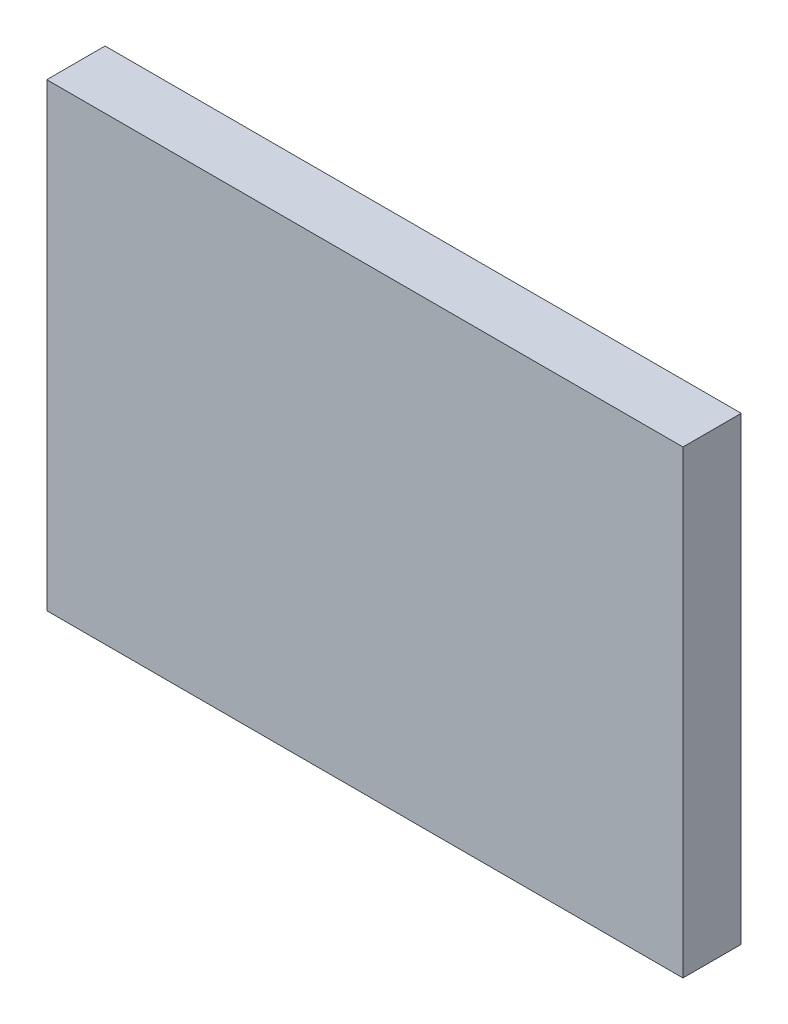
ISO-10303-21;
HEADER;
FILE_DESCRIPTION(('STEP AP214'),'2;1');
FILE_NAME('part.step','',(''),(''),'','','');
FILE_SCHEMA(('AUTOMOTIVE_DESIGN { 1 0 10303 214 1 1 1 1 }'));
ENDSEC;
DATA;
#1=APPLICATION_CONTEXT('core data for automotive mechanical design processes');
#2=APPLICATION_PROTOCOL_DEFINITION('international standard','automotive_design',2000,#1);
#3=PRODUCT_CONTEXT('',#1,'mechanical');
#4=PRODUCT('Part','Part','',(#3));
#5=PRODUCT_RELATED_PRODUCT_CATEGORY('part','',(#4));
#6=PRODUCT_DEFINITION_FORMATION('','',#4);
#7=PRODUCT_DEFINITION_CONTEXT('part definition',#1,'design');
#8=PRODUCT_DEFINITION('design','',#6,#7);
#9=PRODUCT_DEFINITION_SHAPE('','',#8);
#10=(LENGTH_UNIT() NAMED_UNIT(*) SI_UNIT(.MILLI.,.METRE.));
#11=(NAMED_UNIT(*) PLANE_ANGLE_UNIT() SI_UNIT($,.RADIAN.));
#12=(NAMED_UNIT(*) SI_UNIT($,.STERADIAN.) SOLID_ANGLE_UNIT());
#13=UNCERTAINTY_MEASURE_WITH_UNIT(LENGTH_MEASURE(1.E-05),#10,'distance_accuracy_value','');
#14=(GEOMETRIC_REPRESENTATION_CONTEXT(3) GLOBAL_UNCERTAINTY_ASSIGNED_CONTEXT((#13)) GLOBAL_UNIT_ASSIGNED_CONTEXT((#10,
#11,#12)) REPRESENTATION_CONTEXT('',''));
#15=CARTESIAN_POINT('',(0.,0.,0.));
#16=DIRECTION('',(0.,0.,1.));
#17=DIRECTION('',(1.,0.,0.));
#18=AXIS2_PLACEMENT_3D('',#15,#16,#17);
#19=CARTESIAN_POINT('',(6.912,3.888,1.));
#20=DIRECTION('',(0.,-1.,0.));
#21=DIRECTION('',(1.,0.,0.));
#22=AXIS2_PLACEMENT_3D('',#19,#20,#21);
#23=PLANE('',#22);
#24=DIRECTION('',(-1.,0.,0.));
#25=VECTOR('',#24,1.);
#26=CARTESIAN_POINT('',(6.912,3.888,0.));
#27=LINE('',#26,#25);
#28=CARTESIAN_POINT('',(6.912,3.888,0.));
#29=VERTEX_POINT('',#28);
#30=CARTESIAN_POINT('',(0.,3.888,0.));
#31=VERTEX_POINT('',#30);
#32=EDGE_CURVE('E202',#29,#31,#27,.T.);
#33=ORIENTED_EDGE('',*,*,#32,.T.);
#34=DIRECTION('',(0.,0.,-1.));
#35=VECTOR('',#34,1.);
#36=CARTESIAN_POINT('',(0.,3.888,1.));
#37=LINE('',#36,#35);
#38=CARTESIAN_POINT('',(0.,3.888,1.));
#39=VERTEX_POINT('',#38);
#40=EDGE_CURVE('E11',#39,#31,#37,.T.);
#41=ORIENTED_EDGE('',*,*,#40,.F.);
#42=DIRECTION('',(-1.,0.,0.));
#43=VECTOR('',#42,1.);
#44=CARTESIAN_POINT('',(6.912,3.888,1.));
#45=LINE('',#44,#43);
#46=CARTESIAN_POINT('',(6.912,3.888,1.));
#47=VERTEX_POINT('',#46);
#48=EDGE_CURVE('E203',#47,#39,#45,.T.);
#49=ORIENTED_EDGE('',*,*,#48,.F.);
#50=DIRECTION('',(0.,0.,-1.));
#51=VECTOR('',#50,1.);
#52=CARTESIAN_POINT('',(6.912,3.888,1.));
#53=LINE('',#52,#51);
#54=EDGE_CURVE('E213',#47,#29,#53,.T.);
#55=ORIENTED_EDGE('',*,*,#54,.T.);
#56=EDGE_LOOP('',(#33,#41,#49,#55));
#57=FACE_BOUND('',#56,.T.);
#58=ADVANCED_FACE('F36',(#57),#23,.F.);
#59=CARTESIAN_POINT('',(0.,0.,1.));
#60=DIRECTION('',(-1.,0.,0.));
#61=DIRECTION('',(0.,-1.,0.));
#62=AXIS2_PLACEMENT_3D('',#59,#60,#61);
#63=PLANE('',#62);
#64=DIRECTION('',(0.,1.,0.));
#65=VECTOR('',#64,1.);
#66=CARTESIAN_POINT('',(0.,0.,0.));
#67=LINE('',#66,#65);
#68=CARTESIAN_POINT('',(0.,0.,0.));
#69=VERTEX_POINT('',#68);
#70=EDGE_CURVE('E215',#69,#31,#67,.T.);
#71=ORIENTED_EDGE('',*,*,#70,.F.);
#72=DIRECTION('',(0.,0.,-1.));
#73=VECTOR('',#72,1.);
#74=CARTESIAN_POINT('',(0.,0.,1.));
#75=LINE('',#74,#73);
#76=CARTESIAN_POINT('',(0.,0.,1.));
#77=VERTEX_POINT('',#76);
#78=EDGE_CURVE('E43',#77,#69,#75,.T.);
#79=ORIENTED_EDGE('',*,*,#78,.F.);
#80=DIRECTION('',(0.,1.,0.));
#81=VECTOR('',#80,1.);
#82=CARTESIAN_POINT('',(0.,0.,1.));
#83=LINE('',#82,#81);
#84=EDGE_CURVE('E206',#77,#39,#83,.T.);
#85=ORIENTED_EDGE('',*,*,#84,.T.);
#86=ORIENTED_EDGE('',*,*,#40,.T.);
#87=EDGE_LOOP('',(#71,#79,#85,#86));
#88=FACE_BOUND('',#87,.T.);
#89=ADVANCED_FACE('F228',(#88),#63,.T.);
#90=CARTESIAN_POINT('',(6.912,0.,1.));
#91=DIRECTION('',(0.,-1.,0.));
#92=DIRECTION('',(0.,0.,-1.));
#93=AXIS2_PLACEMENT_3D('',#90,#91,#92);
#94=PLANE('',#93);
#95=DIRECTION('',(-1.,0.,0.));
#96=VECTOR('',#95,1.);
#97=CARTESIAN_POINT('',(6.912,0.,0.));
#98=LINE('',#97,#96);
#99=CARTESIAN_POINT('',(6.912,0.,0.));
#100=VERTEX_POINT('',#99);
#101=EDGE_CURVE('E218',#100,#69,#98,.T.);
#102=ORIENTED_EDGE('',*,*,#101,.F.);
#103=DIRECTION('',(0.,0.,-1.));
#104=VECTOR('',#103,1.);
#105=CARTESIAN_POINT('',(6.912,0.,1.));
#106=LINE('',#105,#104);
#107=CARTESIAN_POINT('',(6.912,0.,1.));
#108=VERTEX_POINT('',#107);
#109=EDGE_CURVE('E59',#108,#100,#106,.T.);
#110=ORIENTED_EDGE('',*,*,#109,.F.);
#111=DIRECTION('',(-1.,0.,0.));
#112=VECTOR('',#111,1.);
#113=CARTESIAN_POINT('',(6.912,0.,1.));
#114=LINE('',#113,#112);
#115=EDGE_CURVE('E208',#108,#77,#114,.T.);
#116=ORIENTED_EDGE('',*,*,#115,.T.);
#117=ORIENTED_EDGE('',*,*,#78,.T.);
#118=EDGE_LOOP('',(#102,#110,#116,#117));
#119=FACE_BOUND('',#118,.T.);
#120=ADVANCED_FACE('F224',(#119),#94,.T.);
#121=CARTESIAN_POINT('',(6.912,0.,1.));
#122=DIRECTION('',(-1.,0.,0.));
#123=DIRECTION('',(0.,0.,1.));
#124=AXIS2_PLACEMENT_3D('',#121,#122,#123);
#125=PLANE('',#124);
#126=DIRECTION('',(0.,1.,0.));
#127=VECTOR('',#126,1.);
#128=CARTESIAN_POINT('',(6.912,0.,0.));
#129=LINE('',#128,#127);
#130=EDGE_CURVE('E78',#100,#29,#129,.T.);
#131=ORIENTED_EDGE('',*,*,#130,.T.);
#132=ORIENTED_EDGE('',*,*,#54,.F.);
#133=DIRECTION('',(0.,1.,0.));
#134=VECTOR('',#133,1.);
#135=CARTESIAN_POINT('',(6.912,0.,1.));
#136=LINE('',#135,#134);
#137=EDGE_CURVE('E210',#108,#47,#136,.T.);
#138=ORIENTED_EDGE('',*,*,#137,.F.);
#139=ORIENTED_EDGE('',*,*,#109,.T.);
#140=EDGE_LOOP('',(#131,#132,#138,#139));
#141=FACE_BOUND('',#140,.T.);
#142=ADVANCED_FACE('F232',(#141),#125,.F.);
#143=CARTESIAN_POINT('',(0.,0.,0.));
#144=DIRECTION('',(0.,0.,-1.));
#145=DIRECTION('',(-1.,0.,0.));
#146=AXIS2_PLACEMENT_3D('',#143,#144,#145);
#147=PLANE('',#146);
#148=DIRECTION('',(-0.707106781186548,-0.707106781186547,0.));
#149=VECTOR('',#148,1.);
#150=CARTESIAN_POINT('',(3.456,2.444,0.));
#151=LINE('',#150,#149);
#152=CARTESIAN_POINT('',(3.456,2.444,0.));
#153=VERTEX_POINT('',#152);
#154=CARTESIAN_POINT('',(2.96106125524031,1.94906125524031,0.));
#155=VERTEX_POINT('',#154);
#156=EDGE_CURVE('E422',#153,#155,#151,.T.);
#157=ORIENTED_EDGE('',*,*,#156,.T.);
#158=DIRECTION('',(-0.707106781186547,0.707106781186547,0.));
#159=VECTOR('',#158,1.);
#160=CARTESIAN_POINT('',(3.46106125524031,1.44906125524031,0.));
#161=LINE('',#160,#159);
#162=CARTESIAN_POINT('',(3.46106125524031,1.44906125524031,0.));
#163=VERTEX_POINT('',#162);
#164=EDGE_CURVE('E426',#163,#155,#161,.T.);
#165=ORIENTED_EDGE('',*,*,#164,.F.);
#166=DIRECTION('',(-0.707106781186548,-0.707106781186547,0.));
#167=VECTOR('',#166,1.);
#168=CARTESIAN_POINT('',(3.956,1.944,0.));
#169=LINE('',#168,#167);
#170=CARTESIAN_POINT('',(3.956,1.944,0.));
#171=VERTEX_POINT('',#170);
#172=EDGE_CURVE('E428',#171,#163,#169,.T.);
#173=ORIENTED_EDGE('',*,*,#172,.F.);
#174=DIRECTION('',(-0.707106781186547,0.707106781186547,0.));
#175=VECTOR('',#174,1.);
#176=CARTESIAN_POINT('',(3.956,1.944,0.));
#177=LINE('',#176,#175);
#178=EDGE_CURVE('E163',#171,#153,#177,.T.);
#179=ORIENTED_EDGE('',*,*,#178,.T.);
#180=EDGE_LOOP('',(#157,#165,#173,#179));
#181=FACE_BOUND('',#180,.T.);
#182=ORIENTED_EDGE('',*,*,#32,.F.);
#183=ORIENTED_EDGE('',*,*,#130,.F.);
#184=ORIENTED_EDGE('',*,*,#101,.T.);
#185=ORIENTED_EDGE('',*,*,#70,.T.);
#186=EDGE_LOOP('',(#182,#183,#184,#185));
#187=FACE_BOUND('',#186,.T.);
#188=ADVANCED_FACE('F231',(#181,#187),#147,.T.);
#189=CARTESIAN_POINT('',(-2.,-2.,2.));
#190=DIRECTION('',(0.,1.,0.));
#191=DIRECTION('',(0.,0.,1.));
#192=AXIS2_PLACEMENT_3D('',#189,#190,#191);
#193=PLANE('',#192);
#194=DIRECTION('',(1.,0.,0.));
#195=VECTOR('',#194,1.);
#196=CARTESIAN_POINT('',(-2.,-2.,1.));
#197=LINE('',#196,#195);
#198=CARTESIAN_POINT('',(-2.,-2.,1.));
#199=VERTEX_POINT('',#198);
#200=CARTESIAN_POINT('',(8.912,-2.,1.));
#201=VERTEX_POINT('',#200);
#202=EDGE_CURVE('E167',#199,#201,#197,.T.);
#203=ORIENTED_EDGE('',*,*,#202,.T.);
#204=DIRECTION('',(0.,0.,-1.));
#205=VECTOR('',#204,1.);
#206=CARTESIAN_POINT('',(8.912,-2.,2.));
#207=LINE('',#206,#205);
#208=CARTESIAN_POINT('',(8.912,-2.,2.));
#209=VERTEX_POINT('',#208);
#210=EDGE_CURVE('E200',#209,#201,#207,.T.);
#211=ORIENTED_EDGE('',*,*,#210,.F.);
#212=DIRECTION('',(1.,0.,0.));
#213=VECTOR('',#212,1.);
#214=CARTESIAN_POINT('',(-2.,-2.,2.));
#215=LINE('',#214,#213);
#216=CARTESIAN_POINT('',(-2.,-2.,2.));
#217=VERTEX_POINT('',#216);
#218=EDGE_CURVE('E173',#217,#209,#215,.T.);
#219=ORIENTED_EDGE('',*,*,#218,.F.);
#220=DIRECTION('',(0.,0.,-1.));
#221=VECTOR('',#220,1.);
#222=CARTESIAN_POINT('',(-2.,-2.,2.));
#223=LINE('',#222,#221);
#224=EDGE_CURVE('E184',#217,#199,#223,.T.);
#225=ORIENTED_EDGE('',*,*,#224,.T.);
#226=EDGE_LOOP('',(#203,#211,#219,#225));
#227=FACE_BOUND('',#226,.T.);
#228=ADVANCED_FACE('F246',(#227),#193,.F.);
#229=CARTESIAN_POINT('',(8.912,5.888,2.));
#230=DIRECTION('',(1.,0.,0.));
#231=DIRECTION('',(0.,0.,-1.));
#232=AXIS2_PLACEMENT_3D('',#229,#230,#231);
#233=PLANE('',#232);
#234=DIRECTION('',(0.,-1.,0.));
#235=VECTOR('',#234,1.);
#236=CARTESIAN_POINT('',(8.912,5.888,1.));
#237=LINE('',#236,#235);
#238=CARTESIAN_POINT('',(8.912,5.888,1.));
#239=VERTEX_POINT('',#238);
#240=EDGE_CURVE('E187',#239,#201,#237,.T.);
#241=ORIENTED_EDGE('',*,*,#240,.F.);
#242=DIRECTION('',(0.,0.,-1.));
#243=VECTOR('',#242,1.);
#244=CARTESIAN_POINT('',(8.912,5.888,2.));
#245=LINE('',#244,#243);
#246=CARTESIAN_POINT('',(8.912,5.888,2.));
#247=VERTEX_POINT('',#246);
#248=EDGE_CURVE('E198',#247,#239,#245,.T.);
#249=ORIENTED_EDGE('',*,*,#248,.F.);
#250=DIRECTION('',(0.,-1.,0.));
#251=VECTOR('',#250,1.);
#252=CARTESIAN_POINT('',(8.912,5.888,2.));
#253=LINE('',#252,#251);
#254=EDGE_CURVE('E175',#247,#209,#253,.T.);
#255=ORIENTED_EDGE('',*,*,#254,.T.);
#256=ORIENTED_EDGE('',*,*,#210,.T.);
#257=EDGE_LOOP('',(#241,#249,#255,#256));
#258=FACE_BOUND('',#257,.T.);
#259=ADVANCED_FACE('F257',(#258),#233,.T.);
#260=CARTESIAN_POINT('',(-2.,5.888,2.));
#261=DIRECTION('',(0.,1.,0.));
#262=DIRECTION('',(0.,0.,1.));
#263=AXIS2_PLACEMENT_3D('',#260,#261,#262);
#264=PLANE('',#263);
#265=DIRECTION('',(1.,0.,0.));
#266=VECTOR('',#265,1.);
#267=CARTESIAN_POINT('',(-2.,5.888,1.));
#268=LINE('',#267,#266);
#269=CARTESIAN_POINT('',(-2.,5.888,1.));
#270=VERTEX_POINT('',#269);
#271=EDGE_CURVE('E190',#270,#239,#268,.T.);
#272=ORIENTED_EDGE('',*,*,#271,.F.);
#273=DIRECTION('',(0.,0.,-1.));
#274=VECTOR('',#273,1.);
#275=CARTESIAN_POINT('',(-2.,5.888,2.));
#276=LINE('',#275,#274);
#277=CARTESIAN_POINT('',(-2.,5.888,2.));
#278=VERTEX_POINT('',#277);
#279=EDGE_CURVE('E196',#278,#270,#276,.T.);
#280=ORIENTED_EDGE('',*,*,#279,.F.);
#281=DIRECTION('',(1.,0.,0.));
#282=VECTOR('',#281,1.);
#283=CARTESIAN_POINT('',(-2.,5.888,2.));
#284=LINE('',#283,#282);
#285=EDGE_CURVE('E179',#278,#247,#284,.T.);
#286=ORIENTED_EDGE('',*,*,#285,.T.);
#287=ORIENTED_EDGE('',*,*,#248,.T.);
#288=EDGE_LOOP('',(#272,#280,#286,#287));
#289=FACE_BOUND('',#288,.T.);
#290=ADVANCED_FACE('F254',(#289),#264,.T.);
#291=CARTESIAN_POINT('',(-2.,5.888,2.));
#292=DIRECTION('',(1.,0.,0.));
#293=DIRECTION('',(0.,1.,0.));
#294=AXIS2_PLACEMENT_3D('',#291,#292,#293);
#295=PLANE('',#294);
#296=DIRECTION('',(0.,-1.,0.));
#297=VECTOR('',#296,1.);
#298=CARTESIAN_POINT('',(-2.,5.888,1.));
#299=LINE('',#298,#297);
#300=EDGE_CURVE('E176',#270,#199,#299,.T.);
#301=ORIENTED_EDGE('',*,*,#300,.T.);
#302=ORIENTED_EDGE('',*,*,#224,.F.);
#303=DIRECTION('',(0.,-1.,0.));
#304=VECTOR('',#303,1.);
#305=CARTESIAN_POINT('',(-2.,5.888,2.));
#306=LINE('',#305,#304);
#307=EDGE_CURVE('E182',#278,#217,#306,.T.);
#308=ORIENTED_EDGE('',*,*,#307,.F.);
#309=ORIENTED_EDGE('',*,*,#279,.T.);
#310=EDGE_LOOP('',(#301,#302,#308,#309));
#311=FACE_BOUND('',#310,.T.);
#312=ADVANCED_FACE('F251',(#311),#295,.F.);
#313=CARTESIAN_POINT('',(0.,0.,2.));
#314=DIRECTION('',(0.,0.,-1.));
#315=DIRECTION('',(-1.,0.,0.));
#316=AXIS2_PLACEMENT_3D('',#313,#314,#315);
#317=PLANE('',#316);
#318=ORIENTED_EDGE('',*,*,#218,.T.);
#319=ORIENTED_EDGE('',*,*,#254,.F.);
#320=ORIENTED_EDGE('',*,*,#285,.F.);
#321=ORIENTED_EDGE('',*,*,#307,.T.);
#322=EDGE_LOOP('',(#318,#319,#320,#321));
#323=FACE_BOUND('',#322,.T.);
#324=ADVANCED_FACE('F238',(#323),#317,.F.);
#325=CARTESIAN_POINT('',(0.,0.,1.));
#326=DIRECTION('',(0.,0.,-1.));
#327=DIRECTION('',(-1.,0.,0.));
#328=AXIS2_PLACEMENT_3D('',#325,#326,#327);
#329=PLANE('',#328);
#330=ORIENTED_EDGE('',*,*,#137,.T.);
#331=ORIENTED_EDGE('',*,*,#48,.T.);
#332=ORIENTED_EDGE('',*,*,#84,.F.);
#333=ORIENTED_EDGE('',*,*,#115,.F.);
#334=EDGE_LOOP('',(#330,#331,#332,#333));
#335=FACE_BOUND('',#334,.T.);
#336=ORIENTED_EDGE('',*,*,#202,.F.);
#337=ORIENTED_EDGE('',*,*,#300,.F.);
#338=ORIENTED_EDGE('',*,*,#271,.T.);
#339=ORIENTED_EDGE('',*,*,#240,.T.);
#340=EDGE_LOOP('',(#336,#337,#338,#339));
#341=FACE_BOUND('',#340,.T.);
#342=ADVANCED_FACE('F234',(#335,#341),#329,.T.);
#343=CARTESIAN_POINT('',(3.456,2.444,-0.48));
#344=DIRECTION('',(-0.707106781186547,0.707106781186548,0.));
#345=DIRECTION('',(-0.707106781186548,-0.707106781186547,0.));
#346=AXIS2_PLACEMENT_3D('',#343,#344,#345);
#347=PLANE('',#346);
#348=DIRECTION('',(0.583157796849037,0.583157796849036,0.565556334902506));
#349=VECTOR('',#348,1.);
#350=CARTESIAN_POINT('',(3.29769187859723,2.28569187859723,-0.153529904615212));
#351=LINE('',#350,#349);
#352=CARTESIAN_POINT('',(2.96106125524031,1.94906125524031,-0.48));
#353=VERTEX_POINT('',#352);
#354=CARTESIAN_POINT('',(3.20853062762016,2.19653062762015,-0.24));
#355=VERTEX_POINT('',#354);
#356=EDGE_CURVE('E420',#353,#355,#351,.T.);
#357=ORIENTED_EDGE('',*,*,#356,.F.);
#358=DIRECTION('',(0.,0.,1.));
#359=VECTOR('',#358,1.);
#360=CARTESIAN_POINT('',(2.96106125524031,1.94906125524031,-0.48));
#361=LINE('',#360,#359);
#362=EDGE_CURVE('E151',#353,#155,#361,.T.);
#363=ORIENTED_EDGE('',*,*,#362,.T.);
#364=ORIENTED_EDGE('',*,*,#156,.F.);
#365=DIRECTION('',(0.,0.,1.));
#366=VECTOR('',#365,1.);
#367=CARTESIAN_POINT('',(3.456,2.444,-0.48));
#368=LINE('',#367,#366);
#369=CARTESIAN_POINT('',(3.456,2.444,-0.48));
#370=VERTEX_POINT('',#369);
#371=EDGE_CURVE('E165',#370,#153,#368,.T.);
#372=ORIENTED_EDGE('',*,*,#371,.F.);
#373=DIRECTION('',(0.583157796849037,0.583157796849036,-0.565556334902506));
#374=VECTOR('',#373,1.);
#375=CARTESIAN_POINT('',(3.456,2.444,-0.479999999999999));
#376=LINE('',#375,#374);
#377=EDGE_CURVE('E147',#355,#370,#376,.T.);
#378=ORIENTED_EDGE('',*,*,#377,.F.);
#379=EDGE_LOOP('',(#357,#363,#364,#372,#378));
#380=FACE_BOUND('',#379,.T.);
#381=ADVANCED_FACE('F237',(#380),#347,.T.);
#382=CARTESIAN_POINT('',(3.956,1.944,-0.48));
#383=DIRECTION('',(0.707106781186548,0.707106781186548,0.));
#384=DIRECTION('',(-0.707106781186548,0.707106781186548,0.));
#385=AXIS2_PLACEMENT_3D('',#382,#383,#384);
#386=PLANE('',#385);
#387=ORIENTED_EDGE('',*,*,#178,.F.);
#388=DIRECTION('',(0.,0.,1.));
#389=VECTOR('',#388,1.);
#390=CARTESIAN_POINT('',(3.956,1.944,-0.48));
#391=LINE('',#390,#389);
#392=CARTESIAN_POINT('',(3.956,1.944,-0.48));
#393=VERTEX_POINT('',#392);
#394=EDGE_CURVE('E156',#393,#171,#391,.T.);
#395=ORIENTED_EDGE('',*,*,#394,.F.);
#396=DIRECTION('',(-0.707106781186547,0.707106781186547,0.));
#397=VECTOR('',#396,1.);
#398=CARTESIAN_POINT('',(3.956,1.944,-0.48));
#399=LINE('',#398,#397);
#400=EDGE_CURVE('E140',#393,#370,#399,.T.);
#401=ORIENTED_EDGE('',*,*,#400,.T.);
#402=ORIENTED_EDGE('',*,*,#371,.T.);
#403=EDGE_LOOP('',(#387,#395,#401,#402));
#404=FACE_BOUND('',#403,.T.);
#405=ADVANCED_FACE('F161',(#404),#386,.T.);
#406=CARTESIAN_POINT('',(3.956,1.944,-0.48));
#407=DIRECTION('',(-0.707106781186547,0.707106781186548,0.));
#408=DIRECTION('',(-0.707106781186548,-0.707106781186547,0.));
#409=AXIS2_PLACEMENT_3D('',#406,#407,#408);
#410=PLANE('',#409);
#411=DIRECTION('',(0.,0.,1.));
#412=VECTOR('',#411,1.);
#413=CARTESIAN_POINT('',(3.46106125524031,1.44906125524031,-0.48));
#414=LINE('',#413,#412);
#415=CARTESIAN_POINT('',(3.46106125524031,1.44906125524031,-0.48));
#416=VERTEX_POINT('',#415);
#417=EDGE_CURVE('E50',#416,#163,#414,.T.);
#418=ORIENTED_EDGE('',*,*,#417,.F.);
#419=DIRECTION('',(-0.583157796849036,-0.583157796849036,-0.565556334902506));
#420=VECTOR('',#419,1.);
#421=CARTESIAN_POINT('',(3.70853062762016,1.69653062762015,-0.24));
#422=LINE('',#421,#420);
#423=CARTESIAN_POINT('',(3.70853062762016,1.69653062762015,-0.24));
#424=VERTEX_POINT('',#423);
#425=EDGE_CURVE('E158',#424,#416,#422,.T.);
#426=ORIENTED_EDGE('',*,*,#425,.F.);
#427=DIRECTION('',(-0.583157796849036,-0.583157796849036,0.565556334902506));
#428=VECTOR('',#427,1.);
#429=CARTESIAN_POINT('',(3.956,1.944,-0.48));
#430=LINE('',#429,#428);
#431=EDGE_CURVE('E144',#393,#424,#430,.T.);
#432=ORIENTED_EDGE('',*,*,#431,.F.);
#433=ORIENTED_EDGE('',*,*,#394,.T.);
#434=ORIENTED_EDGE('',*,*,#172,.T.);
#435=EDGE_LOOP('',(#418,#426,#432,#433,#434));
#436=FACE_BOUND('',#435,.T.);
#437=ADVANCED_FACE('F155',(#436),#410,.F.);
#438=CARTESIAN_POINT('',(3.46106125524031,1.44906125524031,-0.48));
#439=DIRECTION('',(0.707106781186548,0.707106781186548,0.));
#440=DIRECTION('',(-0.707106781186548,0.707106781186548,0.));
#441=AXIS2_PLACEMENT_3D('',#438,#439,#440);
#442=PLANE('',#441);
#443=ORIENTED_EDGE('',*,*,#164,.T.);
#444=ORIENTED_EDGE('',*,*,#362,.F.);
#445=DIRECTION('',(-0.707106781186547,0.707106781186547,0.));
#446=VECTOR('',#445,1.);
#447=CARTESIAN_POINT('',(3.46106125524031,1.44906125524031,-0.48));
#448=LINE('',#447,#446);
#449=EDGE_CURVE('E152',#416,#353,#448,.T.);
#450=ORIENTED_EDGE('',*,*,#449,.F.);
#451=ORIENTED_EDGE('',*,*,#417,.T.);
#452=EDGE_LOOP('',(#443,#444,#450,#451));
#453=FACE_BOUND('',#452,.T.);
#454=ADVANCED_FACE('F336',(#453),#442,.F.);
#455=CARTESIAN_POINT('',(-24.9151518748113,30.3202131300516,-0.24));
#456=DIRECTION('',(-0.399908719552573,-0.399908719552572,0.824709665307522));
#457=DIRECTION('',(0.899792910225384,0.,0.436317222566488));
#458=AXIS2_PLACEMENT_3D('',#455,#456,#457);
#459=PLANE('',#458);
#460=CARTESIAN_POINT('',(3.33479594143023,1.82279594143023,-0.360000000000001));
#461=DIRECTION('',(0.399908719552573,0.399908719552572,-0.824709665307521));
#462=DIRECTION('',(-0.899792910225384,0.,-0.436317222566489));
#463=AXIS2_PLACEMENT_3D('',#460,#461,#462);
#464=CIRCLE('',#463,0.0999999999999998);
#465=CARTESIAN_POINT('',(3.24481665040769,1.82279594143023,-0.40363172225665));
#466=VERTEX_POINT('',#465);
#467=EDGE_CURVE('E406',#466,#466,#464,.T.);
#468=ORIENTED_EDGE('',*,*,#467,.F.);
#469=EDGE_LOOP('',(#468));
#470=FACE_BOUND('',#469,.T.);
#471=ORIENTED_EDGE('',*,*,#356,.T.);
#472=DIRECTION('',(0.707106781186547,-0.707106781186548,0.));
#473=VECTOR('',#472,1.);
#474=CARTESIAN_POINT('',(-24.9151518748113,30.3202131300516,-0.24));
#475=LINE('',#474,#473);
#476=EDGE_CURVE('E417',#355,#424,#475,.T.);
#477=ORIENTED_EDGE('',*,*,#476,.T.);
#478=ORIENTED_EDGE('',*,*,#425,.T.);
#479=ORIENTED_EDGE('',*,*,#449,.T.);
#480=EDGE_LOOP('',(#471,#477,#478,#479));
#481=FACE_BOUND('',#480,.T.);
#482=ADVANCED_FACE('F345',(#470,#481),#459,.F.);
#483=CARTESIAN_POINT('',(-24.6676825024314,30.5676825024314,-0.48));
#484=DIRECTION('',(0.399908719552573,0.399908719552572,0.824709665307522));
#485=DIRECTION('',(0.899792910225384,0.,-0.436317222566488));
#486=AXIS2_PLACEMENT_3D('',#483,#484,#485);
#487=PLANE('',#486);
#488=CARTESIAN_POINT('',(3.58226531381008,2.07026531381008,-0.36));
#489=DIRECTION('',(-0.399908719552573,-0.399908719552572,-0.824709665307521));
#490=DIRECTION('',(-0.899792910225384,0.,0.436317222566489));
#491=AXIS2_PLACEMENT_3D('',#488,#489,#490);
#492=CIRCLE('',#491,0.0999999999999994);
#493=CARTESIAN_POINT('',(3.49228602278754,2.07026531381008,-0.316368277743352));
#494=VERTEX_POINT('',#493);
#495=EDGE_CURVE('E407',#494,#494,#492,.T.);
#496=ORIENTED_EDGE('',*,*,#495,.F.);
#497=EDGE_LOOP('',(#496));
#498=FACE_BOUND('',#497,.T.);
#499=ORIENTED_EDGE('',*,*,#377,.T.);
#500=ORIENTED_EDGE('',*,*,#400,.F.);
#501=ORIENTED_EDGE('',*,*,#431,.T.);
#502=ORIENTED_EDGE('',*,*,#476,.F.);
#503=EDGE_LOOP('',(#499,#500,#501,#502));
#504=FACE_BOUND('',#503,.T.);
#505=ADVANCED_FACE('F142',(#498,#504),#487,.F.);
#506=CARTESIAN_POINT('',(3.29480506947497,1.78280506947498,-0.277529033469249));
#507=DIRECTION('',(0.399908719552573,0.399908719552572,-0.824709665307521));
#508=DIRECTION('',(-0.899792910225384,0.,-0.436317222566489));
#509=AXIS2_PLACEMENT_3D('',#506,#507,#508);
#510=CYLINDRICAL_SURFACE('',#509,0.0999999999999998);
#511=CARTESIAN_POINT('',(3.29480506947497,1.78280506947498,-0.277529033469249));
#512=DIRECTION('',(0.399908719552573,0.399908719552572,-0.824709665307521));
#513=DIRECTION('',(-0.899792910225384,0.,-0.436317222566489));
#514=AXIS2_PLACEMENT_3D('',#511,#512,#513);
#515=CIRCLE('',#514,0.0999999999999998);
#516=CARTESIAN_POINT('',(3.20482577845244,1.78280506947498,-0.321160755725898));
#517=VERTEX_POINT('',#516);
#518=EDGE_CURVE('E159',#517,#517,#515,.T.);
#519=ORIENTED_EDGE('',*,*,#518,.F.);
#520=EDGE_LOOP('',(#519));
#521=FACE_BOUND('',#520,.T.);
#522=ORIENTED_EDGE('',*,*,#467,.T.);
#523=EDGE_LOOP('',(#522));
#524=FACE_BOUND('',#523,.T.);
#525=ADVANCED_FACE('F358',(#521,#524),#510,.F.);
#526=CARTESIAN_POINT('',(3.29480506947497,1.78280506947498,-0.277529033469249));
#527=DIRECTION('',(0.399908719552573,0.399908719552572,-0.824709665307521));
#528=DIRECTION('',(-0.899792910225384,0.,-0.436317222566489));
#529=AXIS2_PLACEMENT_3D('',#526,#527,#528);
#530=PLANE('',#529);
#531=ORIENTED_EDGE('',*,*,#518,.T.);
#532=EDGE_LOOP('',(#531));
#533=FACE_BOUND('',#532,.T.);
#534=ADVANCED_FACE('F363',(#533),#530,.T.);
#535=CARTESIAN_POINT('',(3.62225618576534,2.11025618576533,-0.277529033469248));
#536=DIRECTION('',(-0.399908719552573,-0.399908719552572,-0.824709665307521));
#537=DIRECTION('',(-0.899792910225384,0.,0.436317222566489));
#538=AXIS2_PLACEMENT_3D('',#535,#536,#537);
#539=CYLINDRICAL_SURFACE('',#538,0.0999999999999994);
#540=CARTESIAN_POINT('',(3.62225618576534,2.11025618576533,-0.277529033469248));
#541=DIRECTION('',(-0.399908719552573,-0.399908719552572,-0.824709665307521));
#542=DIRECTION('',(-0.899792910225384,0.,0.436317222566489));
#543=AXIS2_PLACEMENT_3D('',#540,#541,#542);
#544=CIRCLE('',#543,0.0999999999999994);
#545=CARTESIAN_POINT('',(3.5322768947428,2.11025618576533,-0.2338973112126));
#546=VERTEX_POINT('',#545);
#547=EDGE_CURVE('E405',#546,#546,#544,.T.);
#548=ORIENTED_EDGE('',*,*,#547,.F.);
#549=EDGE_LOOP('',(#548));
#550=FACE_BOUND('',#549,.T.);
#551=ORIENTED_EDGE('',*,*,#495,.T.);
#552=EDGE_LOOP('',(#551));
#553=FACE_BOUND('',#552,.T.);
#554=ADVANCED_FACE('F374',(#550,#553),#539,.F.);
#555=CARTESIAN_POINT('',(3.62225618576534,2.11025618576533,-0.277529033469248));
#556=DIRECTION('',(-0.399908719552573,-0.399908719552572,-0.824709665307521));
#557=DIRECTION('',(-0.899792910225384,0.,0.436317222566489));
#558=AXIS2_PLACEMENT_3D('',#555,#556,#557);
#559=PLANE('',#558);
#560=ORIENTED_EDGE('',*,*,#547,.T.);
#561=EDGE_LOOP('',(#560));
#562=FACE_BOUND('',#561,.T.);
#563=ADVANCED_FACE('F389',(#562),#559,.T.);
#564=CLOSED_SHELL('',(#58,#89,#120,#142,#188,#228,#259,#290,#312,#324,#342,#381,#405,#437,#454,
#482,#505,#525,#534,#554,#563));
#565=MANIFOLD_SOLID_BREP('B2',#564);
#566=ADVANCED_BREP_SHAPE_REPRESENTATION('',(#18,#565),#14);
#567=SHAPE_DEFINITION_REPRESENTATION(#9,#566);
ENDSEC;
END-ISO-10303-21;
